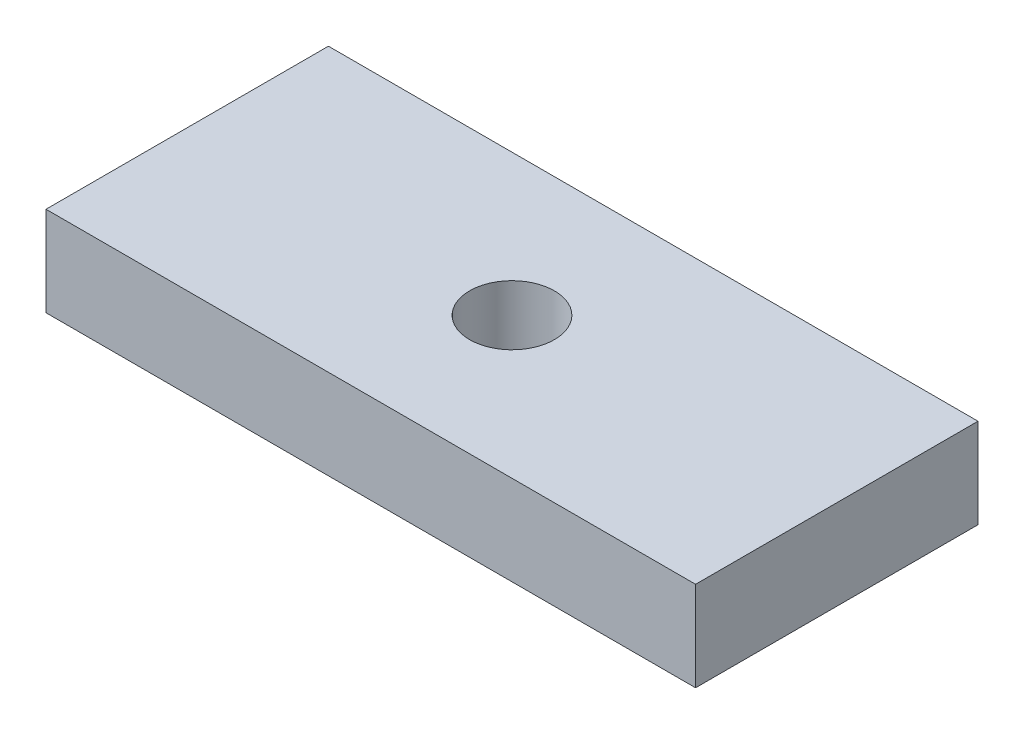
ISO-10303-21;
HEADER;
FILE_DESCRIPTION(('STEP AP214'),'2;1');
FILE_NAME('part.step','',(''),(''),'','','');
FILE_SCHEMA(('AUTOMOTIVE_DESIGN { 1 0 10303 214 1 1 1 1 }'));
ENDSEC;
DATA;
#1=APPLICATION_CONTEXT('core data for automotive mechanical design processes');
#2=APPLICATION_PROTOCOL_DEFINITION('international standard','automotive_design',2000,#1);
#3=PRODUCT_CONTEXT('',#1,'mechanical');
#4=PRODUCT('Part','Part','',(#3));
#5=PRODUCT_RELATED_PRODUCT_CATEGORY('part','',(#4));
#6=PRODUCT_DEFINITION_FORMATION('','',#4);
#7=PRODUCT_DEFINITION_CONTEXT('part definition',#1,'design');
#8=PRODUCT_DEFINITION('design','',#6,#7);
#9=PRODUCT_DEFINITION_SHAPE('','',#8);
#10=(LENGTH_UNIT() NAMED_UNIT(*) SI_UNIT(.MILLI.,.METRE.));
#11=(NAMED_UNIT(*) PLANE_ANGLE_UNIT() SI_UNIT($,.RADIAN.));
#12=(NAMED_UNIT(*) SI_UNIT($,.STERADIAN.) SOLID_ANGLE_UNIT());
#13=UNCERTAINTY_MEASURE_WITH_UNIT(LENGTH_MEASURE(1.E-05),#10,'distance_accuracy_value','');
#14=(GEOMETRIC_REPRESENTATION_CONTEXT(3) GLOBAL_UNCERTAINTY_ASSIGNED_CONTEXT((#13)) GLOBAL_UNIT_ASSIGNED_CONTEXT((#10,
#11,#12)) REPRESENTATION_CONTEXT('',''));
#15=CARTESIAN_POINT('',(0.,0.,0.));
#16=DIRECTION('',(0.,0.,1.));
#17=DIRECTION('',(1.,0.,0.));
#18=AXIS2_PLACEMENT_3D('',#15,#16,#17);
#19=CARTESIAN_POINT('',(0.,6.35,0.));
#20=DIRECTION('',(0.,1.,0.));
#21=DIRECTION('',(0.,0.,1.));
#22=AXIS2_PLACEMENT_3D('',#19,#20,#21);
#23=PLANE('',#22);
#24=DIRECTION('',(0.,0.,-1.));
#25=VECTOR('',#24,1.);
#26=CARTESIAN_POINT('',(23.,6.35,-10.));
#27=LINE('',#26,#25);
#28=CARTESIAN_POINT('',(23.,6.35,10.));
#29=VERTEX_POINT('',#28);
#30=CARTESIAN_POINT('',(23.,6.35,-10.));
#31=VERTEX_POINT('',#30);
#32=EDGE_CURVE('E85',#29,#31,#27,.T.);
#33=ORIENTED_EDGE('',*,*,#32,.T.);
#34=DIRECTION('',(-1.,0.,0.));
#35=VECTOR('',#34,1.);
#36=CARTESIAN_POINT('',(-23.,6.35,-10.));
#37=LINE('',#36,#35);
#38=CARTESIAN_POINT('',(-23.,6.35,-10.));
#39=VERTEX_POINT('',#38);
#40=EDGE_CURVE('E80',#31,#39,#37,.T.);
#41=ORIENTED_EDGE('',*,*,#40,.T.);
#42=DIRECTION('',(0.,0.,1.));
#43=VECTOR('',#42,1.);
#44=CARTESIAN_POINT('',(-23.,6.35,-10.));
#45=LINE('',#44,#43);
#46=CARTESIAN_POINT('',(-23.,6.35,10.));
#47=VERTEX_POINT('',#46);
#48=EDGE_CURVE('E83',#39,#47,#45,.T.);
#49=ORIENTED_EDGE('',*,*,#48,.T.);
#50=DIRECTION('',(1.,0.,0.));
#51=VECTOR('',#50,1.);
#52=CARTESIAN_POINT('',(-23.,6.35,10.));
#53=LINE('',#52,#51);
#54=EDGE_CURVE('E50',#47,#29,#53,.T.);
#55=ORIENTED_EDGE('',*,*,#54,.T.);
#56=EDGE_LOOP('',(#33,#41,#49,#55));
#57=FACE_BOUND('',#56,.T.);
#58=CARTESIAN_POINT('',(0.,6.35,0.));
#59=DIRECTION('',(0.,1.,0.));
#60=DIRECTION('',(0.,0.,1.));
#61=AXIS2_PLACEMENT_3D('',#58,#59,#60);
#62=CIRCLE('',#61,3.);
#63=CARTESIAN_POINT('',(0.,6.35,3.));
#64=VERTEX_POINT('',#63);
#65=EDGE_CURVE('E100',#64,#64,#62,.T.);
#66=ORIENTED_EDGE('',*,*,#65,.F.);
#67=EDGE_LOOP('',(#66));
#68=FACE_BOUND('',#67,.T.);
#69=ADVANCED_FACE('F33',(#57,#68),#23,.T.);
#70=CARTESIAN_POINT('',(0.,0.,0.));
#71=DIRECTION('',(0.,1.,0.));
#72=DIRECTION('',(0.,0.,1.));
#73=AXIS2_PLACEMENT_3D('',#70,#71,#72);
#74=PLANE('',#73);
#75=DIRECTION('',(0.,0.,-1.));
#76=VECTOR('',#75,1.);
#77=CARTESIAN_POINT('',(23.,0.,-10.));
#78=LINE('',#77,#76);
#79=CARTESIAN_POINT('',(23.,0.,10.));
#80=VERTEX_POINT('',#79);
#81=CARTESIAN_POINT('',(23.,0.,-10.));
#82=VERTEX_POINT('',#81);
#83=EDGE_CURVE('E97',#80,#82,#78,.T.);
#84=ORIENTED_EDGE('',*,*,#83,.F.);
#85=DIRECTION('',(1.,0.,0.));
#86=VECTOR('',#85,1.);
#87=CARTESIAN_POINT('',(-23.,0.,10.));
#88=LINE('',#87,#86);
#89=CARTESIAN_POINT('',(-23.,0.,10.));
#90=VERTEX_POINT('',#89);
#91=EDGE_CURVE('E73',#90,#80,#88,.T.);
#92=ORIENTED_EDGE('',*,*,#91,.F.);
#93=DIRECTION('',(0.,0.,1.));
#94=VECTOR('',#93,1.);
#95=CARTESIAN_POINT('',(-23.,0.,-10.));
#96=LINE('',#95,#94);
#97=CARTESIAN_POINT('',(-23.,0.,-10.));
#98=VERTEX_POINT('',#97);
#99=EDGE_CURVE('E67',#98,#90,#96,.T.);
#100=ORIENTED_EDGE('',*,*,#99,.F.);
#101=DIRECTION('',(-1.,0.,0.));
#102=VECTOR('',#101,1.);
#103=CARTESIAN_POINT('',(-23.,0.,-10.));
#104=LINE('',#103,#102);
#105=EDGE_CURVE('E89',#82,#98,#104,.T.);
#106=ORIENTED_EDGE('',*,*,#105,.F.);
#107=EDGE_LOOP('',(#84,#92,#100,#106));
#108=FACE_BOUND('',#107,.T.);
#109=CARTESIAN_POINT('',(0.,0.,0.));
#110=DIRECTION('',(0.,1.,0.));
#111=DIRECTION('',(0.,0.,1.));
#112=AXIS2_PLACEMENT_3D('',#109,#110,#111);
#113=CIRCLE('',#112,3.);
#114=CARTESIAN_POINT('',(0.,0.,3.));
#115=VERTEX_POINT('',#114);
#116=EDGE_CURVE('E112',#115,#115,#113,.T.);
#117=ORIENTED_EDGE('',*,*,#116,.T.);
#118=EDGE_LOOP('',(#117));
#119=FACE_BOUND('',#118,.T.);
#120=ADVANCED_FACE('F108',(#108,#119),#74,.F.);
#121=CARTESIAN_POINT('',(23.,6.35,-10.));
#122=DIRECTION('',(-1.,0.,0.));
#123=DIRECTION('',(0.,0.,1.));
#124=AXIS2_PLACEMENT_3D('',#121,#122,#123);
#125=PLANE('',#124);
#126=ORIENTED_EDGE('',*,*,#83,.T.);
#127=DIRECTION('',(0.,-1.,0.));
#128=VECTOR('',#127,1.);
#129=CARTESIAN_POINT('',(23.,6.35,-10.));
#130=LINE('',#129,#128);
#131=EDGE_CURVE('E11',#31,#82,#130,.T.);
#132=ORIENTED_EDGE('',*,*,#131,.F.);
#133=ORIENTED_EDGE('',*,*,#32,.F.);
#134=DIRECTION('',(0.,-1.,0.));
#135=VECTOR('',#134,1.);
#136=CARTESIAN_POINT('',(23.,6.35,10.));
#137=LINE('',#136,#135);
#138=EDGE_CURVE('E93',#29,#80,#137,.T.);
#139=ORIENTED_EDGE('',*,*,#138,.T.);
#140=EDGE_LOOP('',(#126,#132,#133,#139));
#141=FACE_BOUND('',#140,.T.);
#142=ADVANCED_FACE('F35',(#141),#125,.F.);
#143=CARTESIAN_POINT('',(-23.,6.35,-10.));
#144=DIRECTION('',(0.,0.,1.));
#145=DIRECTION('',(1.,0.,0.));
#146=AXIS2_PLACEMENT_3D('',#143,#144,#145);
#147=PLANE('',#146);
#148=ORIENTED_EDGE('',*,*,#105,.T.);
#149=DIRECTION('',(0.,-1.,0.));
#150=VECTOR('',#149,1.);
#151=CARTESIAN_POINT('',(-23.,6.35,-10.));
#152=LINE('',#151,#150);
#153=EDGE_CURVE('E42',#39,#98,#152,.T.);
#154=ORIENTED_EDGE('',*,*,#153,.F.);
#155=ORIENTED_EDGE('',*,*,#40,.F.);
#156=ORIENTED_EDGE('',*,*,#131,.T.);
#157=EDGE_LOOP('',(#148,#154,#155,#156));
#158=FACE_BOUND('',#157,.T.);
#159=ADVANCED_FACE('F88',(#158),#147,.F.);
#160=CARTESIAN_POINT('',(-23.,6.35,-10.));
#161=DIRECTION('',(1.,0.,0.));
#162=DIRECTION('',(0.,0.,-1.));
#163=AXIS2_PLACEMENT_3D('',#160,#161,#162);
#164=PLANE('',#163);
#165=ORIENTED_EDGE('',*,*,#99,.T.);
#166=DIRECTION('',(0.,-1.,0.));
#167=VECTOR('',#166,1.);
#168=CARTESIAN_POINT('',(-23.,6.35,10.));
#169=LINE('',#168,#167);
#170=EDGE_CURVE('E90',#47,#90,#169,.T.);
#171=ORIENTED_EDGE('',*,*,#170,.F.);
#172=ORIENTED_EDGE('',*,*,#48,.F.);
#173=ORIENTED_EDGE('',*,*,#153,.T.);
#174=EDGE_LOOP('',(#165,#171,#172,#173));
#175=FACE_BOUND('',#174,.T.);
#176=ADVANCED_FACE('F91',(#175),#164,.F.);
#177=CARTESIAN_POINT('',(-23.,6.35,10.));
#178=DIRECTION('',(0.,0.,-1.));
#179=DIRECTION('',(-1.,0.,0.));
#180=AXIS2_PLACEMENT_3D('',#177,#178,#179);
#181=PLANE('',#180);
#182=ORIENTED_EDGE('',*,*,#91,.T.);
#183=ORIENTED_EDGE('',*,*,#138,.F.);
#184=ORIENTED_EDGE('',*,*,#54,.F.);
#185=ORIENTED_EDGE('',*,*,#170,.T.);
#186=EDGE_LOOP('',(#182,#183,#184,#185));
#187=FACE_BOUND('',#186,.T.);
#188=ADVANCED_FACE('F105',(#187),#181,.F.);
#189=CARTESIAN_POINT('',(0.,6.35,0.));
#190=DIRECTION('',(0.,-1.,0.));
#191=DIRECTION('',(0.,0.,-1.));
#192=AXIS2_PLACEMENT_3D('',#189,#190,#191);
#193=CYLINDRICAL_SURFACE('',#192,3.);
#194=ORIENTED_EDGE('',*,*,#65,.T.);
#195=EDGE_LOOP('',(#194));
#196=FACE_BOUND('',#195,.T.);
#197=ORIENTED_EDGE('',*,*,#116,.F.);
#198=EDGE_LOOP('',(#197));
#199=FACE_BOUND('',#198,.T.);
#200=ADVANCED_FACE('F118',(#196,#199),#193,.F.);
#201=CLOSED_SHELL('',(#69,#120,#142,#159,#176,#188,#200));
#202=MANIFOLD_SOLID_BREP('B2',#201);
#203=ADVANCED_BREP_SHAPE_REPRESENTATION('',(#18,#202),#14);
#204=SHAPE_DEFINITION_REPRESENTATION(#9,#203);
ENDSEC;
END-ISO-10303-21;
